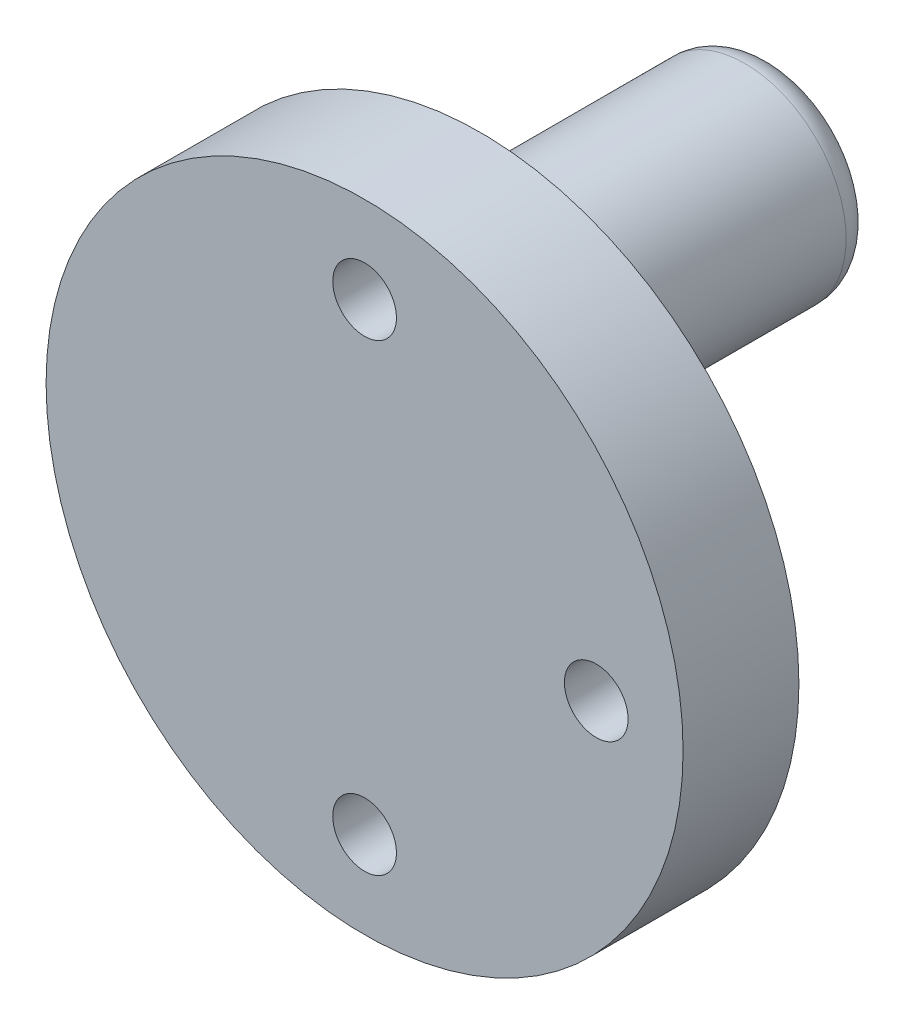
ISO-10303-21;
HEADER;
FILE_DESCRIPTION(('STEP AP214'),'2;1');
FILE_NAME('part.step','',(''),(''),'','','');
FILE_SCHEMA(('AUTOMOTIVE_DESIGN { 1 0 10303 214 1 1 1 1 }'));
ENDSEC;
DATA;
#1=APPLICATION_CONTEXT('core data for automotive mechanical design processes');
#2=APPLICATION_PROTOCOL_DEFINITION('international standard','automotive_design',2000,#1);
#3=PRODUCT_CONTEXT('',#1,'mechanical');
#4=PRODUCT('Part','Part','',(#3));
#5=PRODUCT_RELATED_PRODUCT_CATEGORY('part','',(#4));
#6=PRODUCT_DEFINITION_FORMATION('','',#4);
#7=PRODUCT_DEFINITION_CONTEXT('part definition',#1,'design');
#8=PRODUCT_DEFINITION('design','',#6,#7);
#9=PRODUCT_DEFINITION_SHAPE('','',#8);
#10=(LENGTH_UNIT() NAMED_UNIT(*) SI_UNIT(.MILLI.,.METRE.));
#11=(NAMED_UNIT(*) PLANE_ANGLE_UNIT() SI_UNIT($,.RADIAN.));
#12=(NAMED_UNIT(*) SI_UNIT($,.STERADIAN.) SOLID_ANGLE_UNIT());
#13=UNCERTAINTY_MEASURE_WITH_UNIT(LENGTH_MEASURE(1.E-05),#10,'distance_accuracy_value','');
#14=(GEOMETRIC_REPRESENTATION_CONTEXT(3) GLOBAL_UNCERTAINTY_ASSIGNED_CONTEXT((#13)) GLOBAL_UNIT_ASSIGNED_CONTEXT((#10,
#11,#12)) REPRESENTATION_CONTEXT('',''));
#15=CARTESIAN_POINT('',(0.,0.,0.));
#16=DIRECTION('',(0.,0.,1.));
#17=DIRECTION('',(1.,0.,0.));
#18=AXIS2_PLACEMENT_3D('',#15,#16,#17);
#19=CARTESIAN_POINT('',(0.,0.,0.));
#20=DIRECTION('',(0.,0.,1.));
#21=DIRECTION('',(1.,0.,0.));
#22=AXIS2_PLACEMENT_3D('',#19,#20,#21);
#23=PLANE('',#22);
#24=CARTESIAN_POINT('',(0.,8.,0.));
#25=DIRECTION('',(0.,0.,-1.));
#26=DIRECTION('',(-1.,0.,0.));
#27=AXIS2_PLACEMENT_3D('',#24,#25,#26);
#28=CIRCLE('',#27,2.19999999999999);
#29=CARTESIAN_POINT('',(-2.19999999999999,8.,0.));
#30=VERTEX_POINT('',#29);
#31=EDGE_CURVE('E157',#30,#30,#28,.T.);
#32=ORIENTED_EDGE('',*,*,#31,.F.);
#33=EDGE_LOOP('',(#32));
#34=FACE_BOUND('',#33,.T.);
#35=CARTESIAN_POINT('',(8.00000000000028,1.62088224786583E-13,0.));
#36=DIRECTION('',(0.,0.,-1.));
#37=DIRECTION('',(-1.,0.,0.));
#38=AXIS2_PLACEMENT_3D('',#35,#36,#37);
#39=CIRCLE('',#38,2.19999999999999);
#40=CARTESIAN_POINT('',(5.80000000000029,1.62088224786583E-13,0.));
#41=VERTEX_POINT('',#40);
#42=EDGE_CURVE('E167',#41,#41,#39,.T.);
#43=ORIENTED_EDGE('',*,*,#42,.F.);
#44=EDGE_LOOP('',(#43));
#45=FACE_BOUND('',#44,.T.);
#46=CARTESIAN_POINT('',(3.24155435491522E-13,-8.,0.));
#47=DIRECTION('',(0.,0.,-1.));
#48=DIRECTION('',(-1.,0.,0.));
#49=AXIS2_PLACEMENT_3D('',#46,#47,#48);
#50=CIRCLE('',#49,2.19999999999999);
#51=CARTESIAN_POINT('',(-2.19999999999967,-8.,0.));
#52=VERTEX_POINT('',#51);
#53=EDGE_CURVE('E179',#52,#52,#50,.T.);
#54=ORIENTED_EDGE('',*,*,#53,.F.);
#55=EDGE_LOOP('',(#54));
#56=FACE_BOUND('',#55,.T.);
#57=CARTESIAN_POINT('',(0.,0.,0.));
#58=DIRECTION('',(0.,0.,1.));
#59=DIRECTION('',(1.,0.,0.));
#60=AXIS2_PLACEMENT_3D('',#57,#58,#59);
#61=CIRCLE('',#60,11.);
#62=CARTESIAN_POINT('',(-9.59610007298675,-5.37725426116562,0.));
#63=VERTEX_POINT('',#62);
#64=CARTESIAN_POINT('',(-9.59610007298675,5.37725426116562,0.));
#65=VERTEX_POINT('',#64);
#66=EDGE_CURVE('E62',#63,#65,#61,.T.);
#67=ORIENTED_EDGE('',*,*,#66,.F.);
#68=CARTESIAN_POINT('',(-5.,0.,0.));
#69=DIRECTION('',(0.,0.,1.));
#70=DIRECTION('',(1.,0.,0.));
#71=AXIS2_PLACEMENT_3D('',#68,#69,#70);
#72=CIRCLE('',#71,7.07382493917771);
#73=EDGE_CURVE('E63',#63,#65,#72,.T.);
#74=ORIENTED_EDGE('',*,*,#73,.T.);
#75=EDGE_LOOP('',(#67,#74));
#76=FACE_BOUND('',#75,.T.);
#77=ADVANCED_FACE('F33',(#34,#45,#56,#76),#23,.F.);
#78=CARTESIAN_POINT('',(0.,0.,4.));
#79=DIRECTION('',(0.,0.,1.));
#80=DIRECTION('',(1.,0.,0.));
#81=AXIS2_PLACEMENT_3D('',#78,#79,#80);
#82=PLANE('',#81);
#83=CARTESIAN_POINT('',(0.,8.,4.));
#84=DIRECTION('',(0.,0.,-1.));
#85=DIRECTION('',(-1.,0.,0.));
#86=AXIS2_PLACEMENT_3D('',#83,#84,#85);
#87=CIRCLE('',#86,1.1);
#88=CARTESIAN_POINT('',(-1.1,8.,4.));
#89=VERTEX_POINT('',#88);
#90=EDGE_CURVE('E164',#89,#89,#87,.T.);
#91=ORIENTED_EDGE('',*,*,#90,.T.);
#92=EDGE_LOOP('',(#91));
#93=FACE_BOUND('',#92,.T.);
#94=CARTESIAN_POINT('',(8.00000000000028,1.62088224786583E-13,4.));
#95=DIRECTION('',(0.,0.,-1.));
#96=DIRECTION('',(-1.,0.,0.));
#97=AXIS2_PLACEMENT_3D('',#94,#95,#96);
#98=CIRCLE('',#97,1.1);
#99=CARTESIAN_POINT('',(6.90000000000028,1.62088224786583E-13,4.));
#100=VERTEX_POINT('',#99);
#101=EDGE_CURVE('E176',#100,#100,#98,.T.);
#102=ORIENTED_EDGE('',*,*,#101,.T.);
#103=EDGE_LOOP('',(#102));
#104=FACE_BOUND('',#103,.T.);
#105=CARTESIAN_POINT('',(3.24155435491522E-13,-8.,4.));
#106=DIRECTION('',(0.,0.,-1.));
#107=DIRECTION('',(-1.,0.,0.));
#108=AXIS2_PLACEMENT_3D('',#105,#106,#107);
#109=CIRCLE('',#108,1.1);
#110=CARTESIAN_POINT('',(-1.09999999999967,-8.,4.));
#111=VERTEX_POINT('',#110);
#112=EDGE_CURVE('E188',#111,#111,#109,.T.);
#113=ORIENTED_EDGE('',*,*,#112,.T.);
#114=EDGE_LOOP('',(#113));
#115=FACE_BOUND('',#114,.T.);
#116=CARTESIAN_POINT('',(0.,0.,4.));
#117=DIRECTION('',(0.,0.,1.));
#118=DIRECTION('',(1.,0.,0.));
#119=AXIS2_PLACEMENT_3D('',#116,#117,#118);
#120=CIRCLE('',#119,11.);
#121=CARTESIAN_POINT('',(11.,0.,4.));
#122=VERTEX_POINT('',#121);
#123=EDGE_CURVE('E66',#122,#122,#120,.T.);
#124=ORIENTED_EDGE('',*,*,#123,.T.);
#125=EDGE_LOOP('',(#124));
#126=FACE_BOUND('',#125,.T.);
#127=ADVANCED_FACE('F99',(#93,#104,#115,#126),#82,.T.);
#128=CARTESIAN_POINT('',(0.,0.,4.));
#129=DIRECTION('',(0.,0.,-1.));
#130=DIRECTION('',(-1.,0.,0.));
#131=AXIS2_PLACEMENT_3D('',#128,#129,#130);
#132=CYLINDRICAL_SURFACE('',#131,11.);
#133=ORIENTED_EDGE('',*,*,#123,.F.);
#134=EDGE_LOOP('',(#133));
#135=FACE_BOUND('',#134,.T.);
#136=ORIENTED_EDGE('',*,*,#66,.T.);
#137=CARTESIAN_POINT('',(-9.59610007298675,5.37725426116562,0.));
#138=CARTESIAN_POINT('',(-9.74441031027835,5.1126499088313,3.6735531199123E-05));
#139=CARTESIAN_POINT('',(-9.88169683438999,4.84192318822025,-0.00366287743546752));
#140=CARTESIAN_POINT('',(-10.1334431789603,4.29011766809405,-0.0159708283756039));
#141=CARTESIAN_POINT('',(-10.2479003394196,4.00903766676486,-0.0245797379130945));
#142=CARTESIAN_POINT('',(-10.4510686904931,3.44433182235738,-0.0439405220172528));
#143=CARTESIAN_POINT('',(-10.5402597831205,3.16087643345568,-0.0546448229781949));
#144=CARTESIAN_POINT('',(-10.695404919488,2.58773598006269,-0.0758013483723582));
#145=CARTESIAN_POINT('',(-10.7613670788256,2.29805312889378,-0.0862536596530785));
#146=CARTESIAN_POINT('',(-10.8459866872067,1.84188082829804,-0.100653563135834));
#147=CARTESIAN_POINT('',(-10.8727197250076,1.67687432191886,-0.105447690307613));
#148=CARTESIAN_POINT('',(-10.9186405198175,1.34580969805538,-0.113932967341903));
#149=CARTESIAN_POINT('',(-10.937829801482,1.17975179996686,-0.117624340043968));
#150=CARTESIAN_POINT('',(-10.9688027329817,0.84495923827766,-0.123682265046448));
#151=CARTESIAN_POINT('',(-10.9804968977962,0.676216020983677,-0.126032773491994));
#152=CARTESIAN_POINT('',(-10.9960980282852,0.338316119941995,-0.129201436673079));
#153=CARTESIAN_POINT('',(-11.0000031623352,0.169159348306207,-0.130019230981479));
#154=CARTESIAN_POINT('',(-11.,0.,-0.130000000000002));
#155=B_SPLINE_CURVE_WITH_KNOTS('',3,(#137,#138,#139,#140,#141,#142,#143,#144,#145,#146,#147,
#148,#149,#150,#151,#152,#153,#154),.UNSPECIFIED.,.F.,.F.,(4,2,2,2,2,2,2,2,4),(0.,
0.909654939495508,1.81941580704146,2.71051749077319,3.60130753669218,4.10283593439585,
4.60426291688584,5.11157014749355,5.61899665954972),.UNSPECIFIED.);
#156=CARTESIAN_POINT('',(-11.,0.,-0.130000000000002));
#157=VERTEX_POINT('',#156);
#158=EDGE_CURVE('E52',#65,#157,#155,.T.);
#159=ORIENTED_EDGE('',*,*,#158,.T.);
#160=CARTESIAN_POINT('',(-11.,0.,-0.130000000000002));
#161=CARTESIAN_POINT('',(-11.0000000008368,-0.129709252482248,-0.130005005663245));
#162=CARTESIAN_POINT('',(-10.9977054752569,-0.259406663915965,-0.129529570727976));
#163=CARTESIAN_POINT('',(-10.9885324175582,-0.518631458857045,-0.127661647358164));
#164=CARTESIAN_POINT('',(-10.981653929855,-0.648158843999669,-0.126269167809193));
#165=CARTESIAN_POINT('',(-10.9541543533173,-1.03620915543258,-0.12078275137984));
#166=CARTESIAN_POINT('',(-10.9266691458023,-1.29426159610589,-0.115379797614864));
#167=CARTESIAN_POINT('',(-10.8541924784876,-1.80317069358466,-0.102065970709573));
#168=CARTESIAN_POINT('',(-10.8095168813158,-2.0540741392119,-0.0942007993933031));
#169=CARTESIAN_POINT('',(-10.7028726636645,-2.55212777424451,-0.077174067236573));
#170=CARTESIAN_POINT('',(-10.6409053409451,-2.79927824384705,-0.0680126037094808));
#171=CARTESIAN_POINT('',(-10.5124460594594,-3.24536809508073,-0.0514747131388637));
#172=CARTESIAN_POINT('',(-10.4486942124071,-3.4451010128899,-0.0440692371723403));
#173=CARTESIAN_POINT('',(-10.3098792571837,-3.84061291977521,-0.0302534803239104));
#174=CARTESIAN_POINT('',(-10.2348174672095,-4.03639236662482,-0.0238430836400178));
#175=CARTESIAN_POINT('',(-10.072420076781,-4.42623798517129,-0.0128086765944068));
#176=CARTESIAN_POINT('',(-9.98492007566705,-4.62023652041294,-0.00821234974224769));
#177=CARTESIAN_POINT('',(-9.7987847372779,-5.00291389395281,-0.00180252300613267));
#178=CARTESIAN_POINT('',(-9.70014694728344,-5.1915915490307,1.03626314606528E-05));
#179=CARTESIAN_POINT('',(-9.59610007298675,-5.37725426116562,0.));
#180=B_SPLINE_CURVE_WITH_KNOTS('',3,(#160,#161,#162,#163,#164,#165,#166,#167,#168,#169,#170,
#171,#172,#173,#174,#175,#176,#177,#178,#179),.UNSPECIFIED.,.F.,.F.,(4,2,2,2,2,2,2,2,2,4),(0.,
0.389083076221899,0.778162382535267,1.55613735188995,2.32045202105239,3.08470934310485,
3.71375445132291,4.34272629967724,4.98095626601953,5.61932705592769),.UNSPECIFIED.);
#181=EDGE_CURVE('E59',#157,#63,#180,.T.);
#182=ORIENTED_EDGE('',*,*,#181,.T.);
#183=EDGE_LOOP('',(#136,#159,#182));
#184=FACE_BOUND('',#183,.T.);
#185=ADVANCED_FACE('F61',(#135,#184),#132,.T.);
#186=CARTESIAN_POINT('',(-5.,0.,-0.130000000000002));
#187=DIRECTION('',(0.,0.,-1.));
#188=DIRECTION('',(-1.,0.,0.));
#189=AXIS2_PLACEMENT_3D('',#186,#187,#188);
#190=CYLINDRICAL_SURFACE('',#189,3.5);
#191=CARTESIAN_POINT('',(-5.,0.,-3.83809924354783));
#192=DIRECTION('',(0.,0.,1.));
#193=DIRECTION('',(1.,0.,0.));
#194=AXIS2_PLACEMENT_3D('',#191,#192,#193);
#195=CIRCLE('',#194,3.5);
#196=CARTESIAN_POINT('',(-1.5,0.,-3.83809924354783));
#197=VERTEX_POINT('',#196);
#198=EDGE_CURVE('E12',#197,#197,#195,.F.);
#199=ORIENTED_EDGE('',*,*,#198,.T.);
#200=EDGE_LOOP('',(#199));
#201=FACE_BOUND('',#200,.T.);
#202=CARTESIAN_POINT('',(-5.,0.,-14.13));
#203=DIRECTION('',(0.,0.,-1.));
#204=DIRECTION('',(-1.,0.,0.));
#205=AXIS2_PLACEMENT_3D('',#202,#203,#204);
#206=CIRCLE('',#205,3.5);
#207=CARTESIAN_POINT('',(-8.5,0.,-14.13));
#208=VERTEX_POINT('',#207);
#209=EDGE_CURVE('E41',#208,#208,#206,.F.);
#210=ORIENTED_EDGE('',*,*,#209,.T.);
#211=EDGE_LOOP('',(#210));
#212=FACE_BOUND('',#211,.T.);
#213=ADVANCED_FACE('F111',(#201,#212),#190,.T.);
#214=CARTESIAN_POINT('',(-5.,0.,-15.13));
#215=DIRECTION('',(0.,0.,-1.));
#216=DIRECTION('',(-1.,0.,0.));
#217=AXIS2_PLACEMENT_3D('',#214,#215,#216);
#218=PLANE('',#217);
#219=CARTESIAN_POINT('',(-5.,0.,-15.13));
#220=DIRECTION('',(0.,0.,-1.));
#221=DIRECTION('',(-1.,0.,0.));
#222=AXIS2_PLACEMENT_3D('',#219,#220,#221);
#223=CIRCLE('',#222,2.5);
#224=CARTESIAN_POINT('',(-7.5,0.,-15.13));
#225=VERTEX_POINT('',#224);
#226=EDGE_CURVE('E314',#225,#225,#223,.T.);
#227=ORIENTED_EDGE('',*,*,#226,.T.);
#228=EDGE_LOOP('',(#227));
#229=FACE_BOUND('',#228,.T.);
#230=ADVANCED_FACE('F88',(#229),#218,.T.);
#231=CARTESIAN_POINT('',(-5.,0.,-4.5));
#232=DIRECTION('',(0.,0.,1.));
#233=DIRECTION('',(1.,0.,0.));
#234=AXIS2_PLACEMENT_3D('',#231,#232,#233);
#235=TOROIDAL_SURFACE('',#234,7.07382493917771,4.5);
#236=ORIENTED_EDGE('',*,*,#158,.F.);
#237=ORIENTED_EDGE('',*,*,#73,.F.);
#238=ORIENTED_EDGE('',*,*,#181,.F.);
#239=CARTESIAN_POINT('',(-5.,0.,-0.130000000000002));
#240=DIRECTION('',(0.,0.,-1.));
#241=DIRECTION('',(-1.,0.,0.));
#242=AXIS2_PLACEMENT_3D('',#239,#240,#241);
#243=CIRCLE('',#242,6.);
#244=EDGE_CURVE('E46',#157,#157,#243,.T.);
#245=ORIENTED_EDGE('',*,*,#244,.F.);
#246=EDGE_LOOP('',(#236,#237,#238,#245));
#247=FACE_BOUND('',#246,.T.);
#248=ADVANCED_FACE('F68',(#247),#235,.F.);
#249=CARTESIAN_POINT('',(-5.,0.,-14.13));
#250=DIRECTION('',(0.,0.,-1.));
#251=DIRECTION('',(-1.,0.,0.));
#252=AXIS2_PLACEMENT_3D('',#249,#250,#251);
#253=TOROIDAL_SURFACE('',#252,2.5,1.);
#254=ORIENTED_EDGE('',*,*,#209,.F.);
#255=EDGE_LOOP('',(#254));
#256=FACE_BOUND('',#255,.T.);
#257=ORIENTED_EDGE('',*,*,#226,.F.);
#258=EDGE_LOOP('',(#257));
#259=FACE_BOUND('',#258,.T.);
#260=ADVANCED_FACE('F87',(#256,#259),#253,.T.);
#261=CARTESIAN_POINT('',(-5.,0.,-3.83809924354783));
#262=DIRECTION('',(0.,0.,1.));
#263=DIRECTION('',(1.,0.,0.));
#264=AXIS2_PLACEMENT_3D('',#261,#262,#263);
#265=TOROIDAL_SURFACE('',#264,7.5,4.);
#266=ORIENTED_EDGE('',*,*,#244,.T.);
#267=EDGE_LOOP('',(#266));
#268=FACE_BOUND('',#267,.T.);
#269=ORIENTED_EDGE('',*,*,#198,.F.);
#270=EDGE_LOOP('',(#269));
#271=FACE_BOUND('',#270,.T.);
#272=ADVANCED_FACE('F35',(#268,#271),#265,.F.);
#273=CARTESIAN_POINT('',(3.24155435491522E-13,-8.,0.));
#274=DIRECTION('',(0.,0.,-1.));
#275=DIRECTION('',(-1.,0.,0.));
#276=AXIS2_PLACEMENT_3D('',#273,#274,#275);
#277=CYLINDRICAL_SURFACE('',#276,1.10000000000001);
#278=ORIENTED_EDGE('',*,*,#112,.F.);
#279=EDGE_LOOP('',(#278));
#280=FACE_BOUND('',#279,.T.);
#281=CARTESIAN_POINT('',(3.24155435491522E-13,-8.,2.));
#282=DIRECTION('',(0.,0.,-1.));
#283=DIRECTION('',(-1.,0.,0.));
#284=AXIS2_PLACEMENT_3D('',#281,#282,#283);
#285=CIRCLE('',#284,1.10000000000001);
#286=CARTESIAN_POINT('',(-1.09999999999969,-8.,2.));
#287=VERTEX_POINT('',#286);
#288=EDGE_CURVE('E185',#287,#287,#285,.T.);
#289=ORIENTED_EDGE('',*,*,#288,.T.);
#290=EDGE_LOOP('',(#289));
#291=FACE_BOUND('',#290,.T.);
#292=ADVANCED_FACE('F95',(#280,#291),#277,.F.);
#293=CARTESIAN_POINT('',(1.10000000000034,-8.,2.));
#294=DIRECTION('',(0.,0.,1.));
#295=DIRECTION('',(1.,0.,0.));
#296=AXIS2_PLACEMENT_3D('',#293,#294,#295);
#297=PLANE('',#296);
#298=ORIENTED_EDGE('',*,*,#288,.F.);
#299=EDGE_LOOP('',(#298));
#300=FACE_BOUND('',#299,.T.);
#301=CARTESIAN_POINT('',(3.24155435491522E-13,-8.,2.));
#302=DIRECTION('',(0.,0.,-1.));
#303=DIRECTION('',(-1.,0.,0.));
#304=AXIS2_PLACEMENT_3D('',#301,#302,#303);
#305=CIRCLE('',#304,2.19999999999999);
#306=CARTESIAN_POINT('',(-2.19999999999967,-8.,2.));
#307=VERTEX_POINT('',#306);
#308=EDGE_CURVE('E182',#307,#307,#305,.T.);
#309=ORIENTED_EDGE('',*,*,#308,.T.);
#310=EDGE_LOOP('',(#309));
#311=FACE_BOUND('',#310,.T.);
#312=ADVANCED_FACE('F118',(#300,#311),#297,.F.);
#313=CARTESIAN_POINT('',(3.24155435491522E-13,-8.,0.));
#314=DIRECTION('',(0.,0.,-1.));
#315=DIRECTION('',(-1.,0.,0.));
#316=AXIS2_PLACEMENT_3D('',#313,#314,#315);
#317=CYLINDRICAL_SURFACE('',#316,2.19999999999999);
#318=ORIENTED_EDGE('',*,*,#308,.F.);
#319=EDGE_LOOP('',(#318));
#320=FACE_BOUND('',#319,.T.);
#321=ORIENTED_EDGE('',*,*,#53,.T.);
#322=EDGE_LOOP('',(#321));
#323=FACE_BOUND('',#322,.T.);
#324=ADVANCED_FACE('F122',(#320,#323),#317,.F.);
#325=CARTESIAN_POINT('',(8.00000000000028,1.62088224786583E-13,0.));
#326=DIRECTION('',(0.,0.,-1.));
#327=DIRECTION('',(-1.,0.,0.));
#328=AXIS2_PLACEMENT_3D('',#325,#326,#327);
#329=CYLINDRICAL_SURFACE('',#328,1.10000000000001);
#330=ORIENTED_EDGE('',*,*,#101,.F.);
#331=EDGE_LOOP('',(#330));
#332=FACE_BOUND('',#331,.T.);
#333=CARTESIAN_POINT('',(8.00000000000028,1.62088224786583E-13,2.));
#334=DIRECTION('',(0.,0.,-1.));
#335=DIRECTION('',(-1.,0.,0.));
#336=AXIS2_PLACEMENT_3D('',#333,#334,#335);
#337=CIRCLE('',#336,1.10000000000001);
#338=CARTESIAN_POINT('',(6.90000000000027,1.62088224786583E-13,2.));
#339=VERTEX_POINT('',#338);
#340=EDGE_CURVE('E173',#339,#339,#337,.T.);
#341=ORIENTED_EDGE('',*,*,#340,.T.);
#342=EDGE_LOOP('',(#341));
#343=FACE_BOUND('',#342,.T.);
#344=ADVANCED_FACE('F126',(#332,#343),#329,.F.);
#345=CARTESIAN_POINT('',(9.10000000000029,1.62088224786583E-13,2.));
#346=DIRECTION('',(0.,0.,1.));
#347=DIRECTION('',(1.,0.,0.));
#348=AXIS2_PLACEMENT_3D('',#345,#346,#347);
#349=PLANE('',#348);
#350=ORIENTED_EDGE('',*,*,#340,.F.);
#351=EDGE_LOOP('',(#350));
#352=FACE_BOUND('',#351,.T.);
#353=CARTESIAN_POINT('',(8.00000000000028,1.62088224786583E-13,2.));
#354=DIRECTION('',(0.,0.,-1.));
#355=DIRECTION('',(-1.,0.,0.));
#356=AXIS2_PLACEMENT_3D('',#353,#354,#355);
#357=CIRCLE('',#356,2.19999999999999);
#358=CARTESIAN_POINT('',(5.80000000000029,1.62088224786583E-13,2.));
#359=VERTEX_POINT('',#358);
#360=EDGE_CURVE('E170',#359,#359,#357,.T.);
#361=ORIENTED_EDGE('',*,*,#360,.T.);
#362=EDGE_LOOP('',(#361));
#363=FACE_BOUND('',#362,.T.);
#364=ADVANCED_FACE('F130',(#352,#363),#349,.F.);
#365=CARTESIAN_POINT('',(8.00000000000028,1.62088224786583E-13,0.));
#366=DIRECTION('',(0.,0.,-1.));
#367=DIRECTION('',(-1.,0.,0.));
#368=AXIS2_PLACEMENT_3D('',#365,#366,#367);
#369=CYLINDRICAL_SURFACE('',#368,2.19999999999999);
#370=ORIENTED_EDGE('',*,*,#360,.F.);
#371=EDGE_LOOP('',(#370));
#372=FACE_BOUND('',#371,.T.);
#373=ORIENTED_EDGE('',*,*,#42,.T.);
#374=EDGE_LOOP('',(#373));
#375=FACE_BOUND('',#374,.T.);
#376=ADVANCED_FACE('F134',(#372,#375),#369,.F.);
#377=CARTESIAN_POINT('',(0.,8.,0.));
#378=DIRECTION('',(0.,0.,-1.));
#379=DIRECTION('',(-1.,0.,0.));
#380=AXIS2_PLACEMENT_3D('',#377,#378,#379);
#381=CYLINDRICAL_SURFACE('',#380,1.10000000000001);
#382=ORIENTED_EDGE('',*,*,#90,.F.);
#383=EDGE_LOOP('',(#382));
#384=FACE_BOUND('',#383,.T.);
#385=CARTESIAN_POINT('',(0.,8.,2.));
#386=DIRECTION('',(0.,0.,-1.));
#387=DIRECTION('',(-1.,0.,0.));
#388=AXIS2_PLACEMENT_3D('',#385,#386,#387);
#389=CIRCLE('',#388,1.10000000000001);
#390=CARTESIAN_POINT('',(-1.10000000000001,8.,2.));
#391=VERTEX_POINT('',#390);
#392=EDGE_CURVE('E159',#391,#391,#389,.T.);
#393=ORIENTED_EDGE('',*,*,#392,.T.);
#394=EDGE_LOOP('',(#393));
#395=FACE_BOUND('',#394,.T.);
#396=ADVANCED_FACE('F138',(#384,#395),#381,.F.);
#397=CARTESIAN_POINT('',(1.10000000000001,8.,2.));
#398=DIRECTION('',(0.,0.,1.));
#399=DIRECTION('',(1.,0.,0.));
#400=AXIS2_PLACEMENT_3D('',#397,#398,#399);
#401=PLANE('',#400);
#402=ORIENTED_EDGE('',*,*,#392,.F.);
#403=EDGE_LOOP('',(#402));
#404=FACE_BOUND('',#403,.T.);
#405=CARTESIAN_POINT('',(0.,8.,2.));
#406=DIRECTION('',(0.,0.,-1.));
#407=DIRECTION('',(-1.,0.,0.));
#408=AXIS2_PLACEMENT_3D('',#405,#406,#407);
#409=CIRCLE('',#408,2.19999999999999);
#410=CARTESIAN_POINT('',(-2.19999999999999,8.,2.));
#411=VERTEX_POINT('',#410);
#412=EDGE_CURVE('E155',#411,#411,#409,.T.);
#413=ORIENTED_EDGE('',*,*,#412,.T.);
#414=EDGE_LOOP('',(#413));
#415=FACE_BOUND('',#414,.T.);
#416=ADVANCED_FACE('F142',(#404,#415),#401,.F.);
#417=CARTESIAN_POINT('',(0.,8.,0.));
#418=DIRECTION('',(0.,0.,-1.));
#419=DIRECTION('',(-1.,0.,0.));
#420=AXIS2_PLACEMENT_3D('',#417,#418,#419);
#421=CYLINDRICAL_SURFACE('',#420,2.19999999999999);
#422=ORIENTED_EDGE('',*,*,#412,.F.);
#423=EDGE_LOOP('',(#422));
#424=FACE_BOUND('',#423,.T.);
#425=ORIENTED_EDGE('',*,*,#31,.T.);
#426=EDGE_LOOP('',(#425));
#427=FACE_BOUND('',#426,.T.);
#428=ADVANCED_FACE('F146',(#424,#427),#421,.F.);
#429=CLOSED_SHELL('',(#77,#127,#185,#213,#230,#248,#260,#272,#292,#312,#324,#344,#364,#376,#396,
#416,#428));
#430=MANIFOLD_SOLID_BREP('B2',#429);
#431=ADVANCED_BREP_SHAPE_REPRESENTATION('',(#18,#430),#14);
#432=SHAPE_DEFINITION_REPRESENTATION(#9,#431);
ENDSEC;
END-ISO-10303-21;
